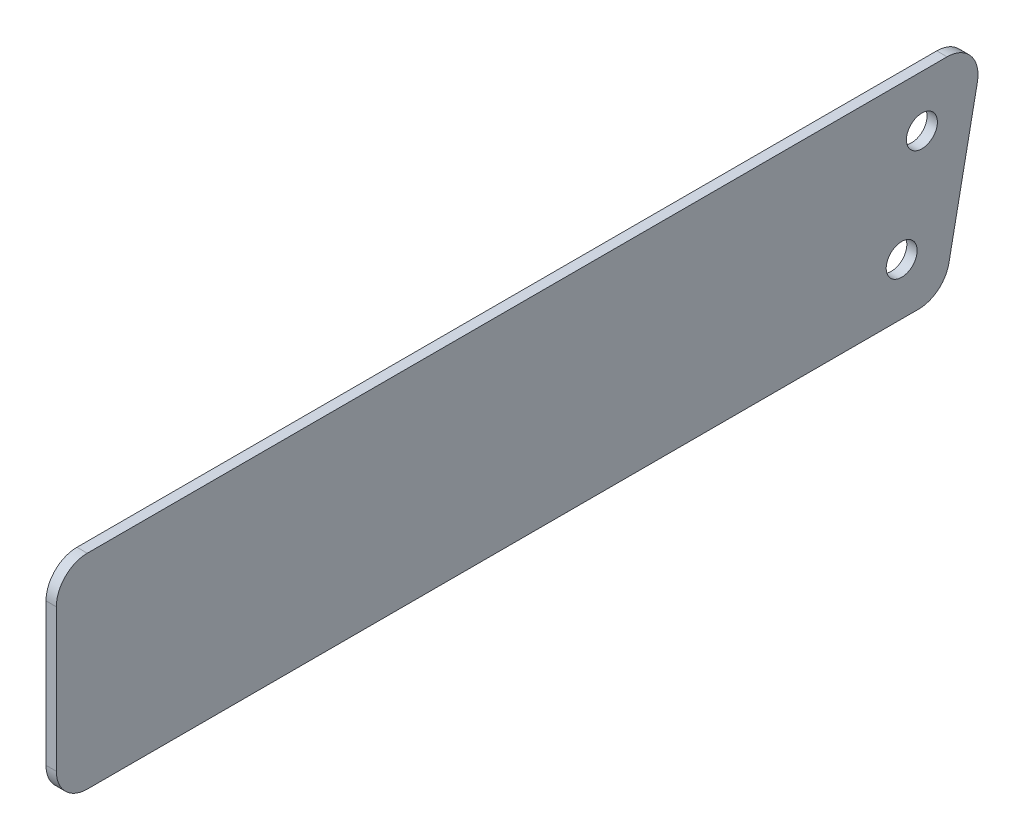
ISO-10303-21;
HEADER;
FILE_DESCRIPTION(('STEP AP214'),'2;1');
FILE_NAME('part.step','',(''),(''),'','','');
FILE_SCHEMA(('AUTOMOTIVE_DESIGN { 1 0 10303 214 1 1 1 1 }'));
ENDSEC;
DATA;
#1=APPLICATION_CONTEXT('core data for automotive mechanical design processes');
#2=APPLICATION_PROTOCOL_DEFINITION('international standard','automotive_design',2000,#1);
#3=PRODUCT_CONTEXT('',#1,'mechanical');
#4=PRODUCT('Part','Part','',(#3));
#5=PRODUCT_RELATED_PRODUCT_CATEGORY('part','',(#4));
#6=PRODUCT_DEFINITION_FORMATION('','',#4);
#7=PRODUCT_DEFINITION_CONTEXT('part definition',#1,'design');
#8=PRODUCT_DEFINITION('design','',#6,#7);
#9=PRODUCT_DEFINITION_SHAPE('','',#8);
#10=(LENGTH_UNIT() NAMED_UNIT(*) SI_UNIT(.MILLI.,.METRE.));
#11=(NAMED_UNIT(*) PLANE_ANGLE_UNIT() SI_UNIT($,.RADIAN.));
#12=(NAMED_UNIT(*) SI_UNIT($,.STERADIAN.) SOLID_ANGLE_UNIT());
#13=UNCERTAINTY_MEASURE_WITH_UNIT(LENGTH_MEASURE(1.E-05),#10,'distance_accuracy_value','');
#14=(GEOMETRIC_REPRESENTATION_CONTEXT(3) GLOBAL_UNCERTAINTY_ASSIGNED_CONTEXT((#13)) GLOBAL_UNIT_ASSIGNED_CONTEXT((#10,
#11,#12)) REPRESENTATION_CONTEXT('',''));
#15=CARTESIAN_POINT('',(0.,0.,0.));
#16=DIRECTION('',(0.,0.,1.));
#17=DIRECTION('',(1.,0.,0.));
#18=AXIS2_PLACEMENT_3D('',#15,#16,#17);
#19=CARTESIAN_POINT('',(1.,-8.27300976539509,-41.3647953242755));
#20=DIRECTION('',(0.,-0.196117290802072,-0.980580444557434));
#21=DIRECTION('',(0.,0.980580444557434,-0.196117290802072));
#22=AXIS2_PLACEMENT_3D('',#19,#20,#21);
#23=PLANE('',#22);
#24=DIRECTION('',(0.,-0.980580444557435,0.196117290802072));
#25=VECTOR('',#24,1.);
#26=CARTESIAN_POINT('',(1.,-8.27300976539509,-41.3647953242755));
#27=LINE('',#26,#25);
#28=CARTESIAN_POINT('',(1.,6.31455035038097,-44.282325227301));
#29=VERTEX_POINT('',#28);
#30=CARTESIAN_POINT('',(1.,-7.49125409519338,-41.5211474165083));
#31=VERTEX_POINT('',#30);
#32=EDGE_CURVE('E204',#29,#31,#27,.T.);
#33=ORIENTED_EDGE('',*,*,#32,.T.);
#34=DIRECTION('',(-1.,0.,0.));
#35=VECTOR('',#34,1.);
#36=CARTESIAN_POINT('',(0.,-7.49125409519338,-41.5211474165083));
#37=LINE('',#36,#35);
#38=CARTESIAN_POINT('',(0.,-7.49125409519338,-41.5211474165083));
#39=VERTEX_POINT('',#38);
#40=EDGE_CURVE('E127',#31,#39,#37,.T.);
#41=ORIENTED_EDGE('',*,*,#40,.T.);
#42=DIRECTION('',(0.,-0.980580444557435,0.196117290802072));
#43=VECTOR('',#42,1.);
#44=CARTESIAN_POINT('',(0.,-8.27300976539509,-41.3647953242755));
#45=LINE('',#44,#43);
#46=CARTESIAN_POINT('',(0.,6.31455035038097,-44.282325227301));
#47=VERTEX_POINT('',#46);
#48=EDGE_CURVE('E110',#47,#39,#45,.T.);
#49=ORIENTED_EDGE('',*,*,#48,.F.);
#50=DIRECTION('',(-1.,0.,0.));
#51=VECTOR('',#50,1.);
#52=CARTESIAN_POINT('',(1.,6.31455035038096,-44.282325227301));
#53=LINE('',#52,#51);
#54=EDGE_CURVE('E124',#47,#29,#53,.F.);
#55=ORIENTED_EDGE('',*,*,#54,.T.);
#56=EDGE_LOOP('',(#33,#41,#49,#55));
#57=FACE_BOUND('',#56,.T.);
#58=ADVANCED_FACE('F41',(#57),#23,.T.);
#59=CARTESIAN_POINT('',(1.,9.90290222278718,0.));
#60=DIRECTION('',(0.,1.,0.));
#61=DIRECTION('',(0.,0.,1.));
#62=AXIS2_PLACEMENT_3D('',#59,#60,#61);
#63=PLANE('',#62);
#64=DIRECTION('',(0.,0.,-1.));
#65=VECTOR('',#64,1.);
#66=CARTESIAN_POINT('',(1.,9.90290222278718,0.));
#67=LINE('',#66,#65);
#68=CARTESIAN_POINT('',(1.,9.90290222278718,42.));
#69=VERTEX_POINT('',#68);
#70=CARTESIAN_POINT('',(1.,9.90290222278718,-41.3405838936287));
#71=VERTEX_POINT('',#70);
#72=EDGE_CURVE('E200',#69,#71,#67,.T.);
#73=ORIENTED_EDGE('',*,*,#72,.T.);
#74=DIRECTION('',(-1.,0.,0.));
#75=VECTOR('',#74,1.);
#76=CARTESIAN_POINT('',(1.,9.90290222278718,-41.3405838936287));
#77=LINE('',#76,#75);
#78=CARTESIAN_POINT('',(0.,9.90290222278718,-41.3405838936287));
#79=VERTEX_POINT('',#78);
#80=EDGE_CURVE('E174',#71,#79,#77,.T.);
#81=ORIENTED_EDGE('',*,*,#80,.T.);
#82=DIRECTION('',(0.,0.,-1.));
#83=VECTOR('',#82,1.);
#84=CARTESIAN_POINT('',(0.,9.90290222278718,0.));
#85=LINE('',#84,#83);
#86=CARTESIAN_POINT('',(0.,9.90290222278718,42.));
#87=VERTEX_POINT('',#86);
#88=EDGE_CURVE('E112',#87,#79,#85,.T.);
#89=ORIENTED_EDGE('',*,*,#88,.F.);
#90=DIRECTION('',(-1.,0.,0.));
#91=VECTOR('',#90,1.);
#92=CARTESIAN_POINT('',(1.,9.90290222278718,42.));
#93=LINE('',#92,#91);
#94=EDGE_CURVE('E171',#87,#69,#93,.F.);
#95=ORIENTED_EDGE('',*,*,#94,.T.);
#96=EDGE_LOOP('',(#73,#81,#89,#95));
#97=FACE_BOUND('',#96,.T.);
#98=ADVANCED_FACE('F241',(#97),#63,.T.);
#99=CARTESIAN_POINT('',(1.,0.,45.));
#100=DIRECTION('',(0.,0.,1.));
#101=DIRECTION('',(1.,0.,0.));
#102=AXIS2_PLACEMENT_3D('',#99,#100,#101);
#103=PLANE('',#102);
#104=DIRECTION('',(0.,1.,0.));
#105=VECTOR('',#104,1.);
#106=CARTESIAN_POINT('',(0.,0.,45.));
#107=LINE('',#106,#105);
#108=CARTESIAN_POINT('',(0.,-6.90290222278717,45.));
#109=VERTEX_POINT('',#108);
#110=CARTESIAN_POINT('',(0.,6.90290222278718,45.));
#111=VERTEX_POINT('',#110);
#112=EDGE_CURVE('E181',#109,#111,#107,.T.);
#113=ORIENTED_EDGE('',*,*,#112,.F.);
#114=DIRECTION('',(-1.,0.,0.));
#115=VECTOR('',#114,1.);
#116=CARTESIAN_POINT('',(1.,-6.90290222278717,45.));
#117=LINE('',#116,#115);
#118=CARTESIAN_POINT('',(1.,-6.90290222278717,45.));
#119=VERTEX_POINT('',#118);
#120=EDGE_CURVE('E11',#109,#119,#117,.F.);
#121=ORIENTED_EDGE('',*,*,#120,.T.);
#122=DIRECTION('',(0.,1.,0.));
#123=VECTOR('',#122,1.);
#124=CARTESIAN_POINT('',(1.,0.,45.));
#125=LINE('',#124,#123);
#126=CARTESIAN_POINT('',(1.,6.90290222278718,45.));
#127=VERTEX_POINT('',#126);
#128=EDGE_CURVE('E142',#119,#127,#125,.T.);
#129=ORIENTED_EDGE('',*,*,#128,.T.);
#130=DIRECTION('',(-1.,0.,0.));
#131=VECTOR('',#130,1.);
#132=CARTESIAN_POINT('',(1.,6.90290222278718,45.));
#133=LINE('',#132,#131);
#134=EDGE_CURVE('E50',#127,#111,#133,.T.);
#135=ORIENTED_EDGE('',*,*,#134,.T.);
#136=EDGE_LOOP('',(#113,#121,#129,#135));
#137=FACE_BOUND('',#136,.T.);
#138=ADVANCED_FACE('F180',(#137),#103,.T.);
#139=CARTESIAN_POINT('',(1.,4.90290222278718,-38.9009731560478));
#140=DIRECTION('',(-1.,0.,0.));
#141=DIRECTION('',(0.,0.,1.));
#142=AXIS2_PLACEMENT_3D('',#139,#140,#141);
#143=CYLINDRICAL_SURFACE('',#142,1.5);
#144=CARTESIAN_POINT('',(1.,4.90290222278718,-38.9009731560478));
#145=DIRECTION('',(1.,0.,0.));
#146=DIRECTION('',(0.,0.,-1.));
#147=AXIS2_PLACEMENT_3D('',#144,#145,#146);
#148=CIRCLE('',#147,1.5);
#149=CARTESIAN_POINT('',(1.,4.90290222278718,-40.4009731560478));
#150=VERTEX_POINT('',#149);
#151=EDGE_CURVE('E207',#150,#150,#148,.T.);
#152=ORIENTED_EDGE('',*,*,#151,.T.);
#153=EDGE_LOOP('',(#152));
#154=FACE_BOUND('',#153,.T.);
#155=CARTESIAN_POINT('',(0.,4.90290222278718,-38.9009731560478));
#156=DIRECTION('',(1.,0.,0.));
#157=DIRECTION('',(0.,0.,-1.));
#158=AXIS2_PLACEMENT_3D('',#155,#156,#157);
#159=CIRCLE('',#158,1.5);
#160=CARTESIAN_POINT('',(0.,4.90290222278718,-40.4009731560478));
#161=VERTEX_POINT('',#160);
#162=EDGE_CURVE('E129',#161,#161,#159,.T.);
#163=ORIENTED_EDGE('',*,*,#162,.F.);
#164=EDGE_LOOP('',(#163));
#165=FACE_BOUND('',#164,.T.);
#166=ADVANCED_FACE('F250',(#154,#165),#143,.F.);
#167=CARTESIAN_POINT('',(1.,-4.90290222278717,-36.9398002480271));
#168=DIRECTION('',(-1.,0.,0.));
#169=DIRECTION('',(0.,0.,1.));
#170=AXIS2_PLACEMENT_3D('',#167,#168,#169);
#171=CYLINDRICAL_SURFACE('',#170,1.5);
#172=CARTESIAN_POINT('',(1.,-4.90290222278717,-36.9398002480271));
#173=DIRECTION('',(1.,0.,0.));
#174=DIRECTION('',(0.,0.,-1.));
#175=AXIS2_PLACEMENT_3D('',#172,#173,#174);
#176=CIRCLE('',#175,1.5);
#177=CARTESIAN_POINT('',(1.,-4.90290222278717,-38.4398002480271));
#178=VERTEX_POINT('',#177);
#179=EDGE_CURVE('E188',#178,#178,#176,.T.);
#180=ORIENTED_EDGE('',*,*,#179,.T.);
#181=EDGE_LOOP('',(#180));
#182=FACE_BOUND('',#181,.T.);
#183=CARTESIAN_POINT('',(0.,-4.90290222278717,-36.9398002480271));
#184=DIRECTION('',(1.,0.,0.));
#185=DIRECTION('',(0.,0.,-1.));
#186=AXIS2_PLACEMENT_3D('',#183,#184,#185);
#187=CIRCLE('',#186,1.5);
#188=CARTESIAN_POINT('',(0.,-4.90290222278717,-38.4398002480271));
#189=VERTEX_POINT('',#188);
#190=EDGE_CURVE('E194',#189,#189,#187,.T.);
#191=ORIENTED_EDGE('',*,*,#190,.F.);
#192=EDGE_LOOP('',(#191));
#193=FACE_BOUND('',#192,.T.);
#194=ADVANCED_FACE('F215',(#182,#193),#171,.F.);
#195=CARTESIAN_POINT('',(1.,-9.90290222278717,0.));
#196=DIRECTION('',(0.,1.,0.));
#197=DIRECTION('',(0.,0.,1.));
#198=AXIS2_PLACEMENT_3D('',#195,#196,#197);
#199=PLANE('',#198);
#200=DIRECTION('',(0.,0.,-1.));
#201=VECTOR('',#200,1.);
#202=CARTESIAN_POINT('',(0.,-9.90290222278717,0.));
#203=LINE('',#202,#201);
#204=CARTESIAN_POINT('',(0.,-9.90290222278717,42.));
#205=VERTEX_POINT('',#204);
#206=CARTESIAN_POINT('',(0.,-9.90290222278717,-38.579406082836));
#207=VERTEX_POINT('',#206);
#208=EDGE_CURVE('E145',#205,#207,#203,.T.);
#209=ORIENTED_EDGE('',*,*,#208,.T.);
#210=DIRECTION('',(-1.,0.,0.));
#211=VECTOR('',#210,1.);
#212=CARTESIAN_POINT('',(1.,-9.90290222278717,-38.579406082836));
#213=LINE('',#212,#211);
#214=CARTESIAN_POINT('',(1.,-9.90290222278717,-38.579406082836));
#215=VERTEX_POINT('',#214);
#216=EDGE_CURVE('E158',#207,#215,#213,.F.);
#217=ORIENTED_EDGE('',*,*,#216,.T.);
#218=DIRECTION('',(0.,0.,-1.));
#219=VECTOR('',#218,1.);
#220=CARTESIAN_POINT('',(1.,-9.90290222278717,0.));
#221=LINE('',#220,#219);
#222=CARTESIAN_POINT('',(1.,-9.90290222278717,42.));
#223=VERTEX_POINT('',#222);
#224=EDGE_CURVE('E135',#223,#215,#221,.T.);
#225=ORIENTED_EDGE('',*,*,#224,.F.);
#226=DIRECTION('',(-1.,0.,0.));
#227=VECTOR('',#226,1.);
#228=CARTESIAN_POINT('',(0.,-9.90290222278717,42.));
#229=LINE('',#228,#227);
#230=EDGE_CURVE('E154',#223,#205,#229,.T.);
#231=ORIENTED_EDGE('',*,*,#230,.T.);
#232=EDGE_LOOP('',(#209,#217,#225,#231));
#233=FACE_BOUND('',#232,.T.);
#234=ADVANCED_FACE('F221',(#233),#199,.F.);
#235=CARTESIAN_POINT('',(1.,0.,0.));
#236=DIRECTION('',(1.,0.,0.));
#237=DIRECTION('',(0.,0.,-1.));
#238=AXIS2_PLACEMENT_3D('',#235,#236,#237);
#239=PLANE('',#238);
#240=ORIENTED_EDGE('',*,*,#179,.F.);
#241=EDGE_LOOP('',(#240));
#242=FACE_BOUND('',#241,.T.);
#243=ORIENTED_EDGE('',*,*,#151,.F.);
#244=EDGE_LOOP('',(#243));
#245=FACE_BOUND('',#244,.T.);
#246=ORIENTED_EDGE('',*,*,#224,.T.);
#247=CARTESIAN_POINT('',(1.,-6.90290222278717,-38.579406082836));
#248=DIRECTION('',(1.,0.,0.));
#249=DIRECTION('',(0.,0.,-1.));
#250=AXIS2_PLACEMENT_3D('',#247,#248,#249);
#251=CIRCLE('',#250,3.);
#252=EDGE_CURVE('E168',#215,#31,#251,.T.);
#253=ORIENTED_EDGE('',*,*,#252,.T.);
#254=ORIENTED_EDGE('',*,*,#32,.F.);
#255=CARTESIAN_POINT('',(1.,6.90290222278718,-41.3405838936287));
#256=DIRECTION('',(1.,0.,0.));
#257=DIRECTION('',(0.,0.,-1.));
#258=AXIS2_PLACEMENT_3D('',#255,#256,#257);
#259=CIRCLE('',#258,3.);
#260=EDGE_CURVE('E133',#29,#71,#259,.T.);
#261=ORIENTED_EDGE('',*,*,#260,.T.);
#262=ORIENTED_EDGE('',*,*,#72,.F.);
#263=CARTESIAN_POINT('',(1.,6.90290222278718,42.));
#264=DIRECTION('',(1.,0.,0.));
#265=DIRECTION('',(0.,0.,-1.));
#266=AXIS2_PLACEMENT_3D('',#263,#264,#265);
#267=CIRCLE('',#266,3.);
#268=EDGE_CURVE('E57',#69,#127,#267,.T.);
#269=ORIENTED_EDGE('',*,*,#268,.T.);
#270=ORIENTED_EDGE('',*,*,#128,.F.);
#271=CARTESIAN_POINT('',(1.,-6.90290222278717,42.));
#272=DIRECTION('',(1.,0.,0.));
#273=DIRECTION('',(0.,0.,-1.));
#274=AXIS2_PLACEMENT_3D('',#271,#272,#273);
#275=CIRCLE('',#274,3.);
#276=EDGE_CURVE('E163',#119,#223,#275,.T.);
#277=ORIENTED_EDGE('',*,*,#276,.T.);
#278=EDGE_LOOP('',(#246,#253,#254,#261,#262,#269,#270,#277));
#279=FACE_BOUND('',#278,.T.);
#280=ADVANCED_FACE('F218',(#242,#245,#279),#239,.T.);
#281=CARTESIAN_POINT('',(0.,0.,0.));
#282=DIRECTION('',(1.,0.,0.));
#283=DIRECTION('',(0.,0.,-1.));
#284=AXIS2_PLACEMENT_3D('',#281,#282,#283);
#285=PLANE('',#284);
#286=ORIENTED_EDGE('',*,*,#190,.T.);
#287=EDGE_LOOP('',(#286));
#288=FACE_BOUND('',#287,.T.);
#289=ORIENTED_EDGE('',*,*,#162,.T.);
#290=EDGE_LOOP('',(#289));
#291=FACE_BOUND('',#290,.T.);
#292=ORIENTED_EDGE('',*,*,#48,.T.);
#293=CARTESIAN_POINT('',(0.,-6.90290222278717,-38.579406082836));
#294=DIRECTION('',(1.,0.,0.));
#295=DIRECTION('',(0.,0.,-1.));
#296=AXIS2_PLACEMENT_3D('',#293,#294,#295);
#297=CIRCLE('',#296,3.);
#298=EDGE_CURVE('E118',#39,#207,#297,.F.);
#299=ORIENTED_EDGE('',*,*,#298,.T.);
#300=ORIENTED_EDGE('',*,*,#208,.F.);
#301=CARTESIAN_POINT('',(0.,-6.90290222278717,42.));
#302=DIRECTION('',(1.,0.,0.));
#303=DIRECTION('',(0.,0.,-1.));
#304=AXIS2_PLACEMENT_3D('',#301,#302,#303);
#305=CIRCLE('',#304,3.);
#306=EDGE_CURVE('E119',#205,#109,#305,.F.);
#307=ORIENTED_EDGE('',*,*,#306,.T.);
#308=ORIENTED_EDGE('',*,*,#112,.T.);
#309=CARTESIAN_POINT('',(0.,6.90290222278718,42.));
#310=DIRECTION('',(1.,0.,0.));
#311=DIRECTION('',(0.,0.,-1.));
#312=AXIS2_PLACEMENT_3D('',#309,#310,#311);
#313=CIRCLE('',#312,3.);
#314=EDGE_CURVE('E139',#111,#87,#313,.F.);
#315=ORIENTED_EDGE('',*,*,#314,.T.);
#316=ORIENTED_EDGE('',*,*,#88,.T.);
#317=CARTESIAN_POINT('',(0.,6.90290222278718,-41.3405838936287));
#318=DIRECTION('',(1.,0.,0.));
#319=DIRECTION('',(0.,0.,-1.));
#320=AXIS2_PLACEMENT_3D('',#317,#318,#319);
#321=CIRCLE('',#320,3.);
#322=EDGE_CURVE('E107',#79,#47,#321,.F.);
#323=ORIENTED_EDGE('',*,*,#322,.T.);
#324=EDGE_LOOP('',(#292,#299,#300,#307,#308,#315,#316,#323));
#325=FACE_BOUND('',#324,.T.);
#326=ADVANCED_FACE('F109',(#288,#291,#325),#285,.F.);
#327=CARTESIAN_POINT('',(1.,-6.90290222278717,-38.579406082836));
#328=DIRECTION('',(1.,0.,0.));
#329=DIRECTION('',(0.,0.,-1.));
#330=AXIS2_PLACEMENT_3D('',#327,#328,#329);
#331=CYLINDRICAL_SURFACE('',#330,3.);
#332=ORIENTED_EDGE('',*,*,#252,.F.);
#333=ORIENTED_EDGE('',*,*,#216,.F.);
#334=ORIENTED_EDGE('',*,*,#298,.F.);
#335=ORIENTED_EDGE('',*,*,#40,.F.);
#336=EDGE_LOOP('',(#332,#333,#334,#335));
#337=FACE_BOUND('',#336,.T.);
#338=ADVANCED_FACE('F231',(#337),#331,.T.);
#339=CARTESIAN_POINT('',(1.,6.90290222278718,-41.3405838936287));
#340=DIRECTION('',(-1.,0.,0.));
#341=DIRECTION('',(0.,0.,1.));
#342=AXIS2_PLACEMENT_3D('',#339,#340,#341);
#343=CYLINDRICAL_SURFACE('',#342,3.);
#344=ORIENTED_EDGE('',*,*,#260,.F.);
#345=ORIENTED_EDGE('',*,*,#54,.F.);
#346=ORIENTED_EDGE('',*,*,#322,.F.);
#347=ORIENTED_EDGE('',*,*,#80,.F.);
#348=EDGE_LOOP('',(#344,#345,#346,#347));
#349=FACE_BOUND('',#348,.T.);
#350=ADVANCED_FACE('F132',(#349),#343,.T.);
#351=CARTESIAN_POINT('',(1.,-6.90290222278717,42.));
#352=DIRECTION('',(1.,0.,0.));
#353=DIRECTION('',(0.,0.,-1.));
#354=AXIS2_PLACEMENT_3D('',#351,#352,#353);
#355=CYLINDRICAL_SURFACE('',#354,3.);
#356=ORIENTED_EDGE('',*,*,#276,.F.);
#357=ORIENTED_EDGE('',*,*,#120,.F.);
#358=ORIENTED_EDGE('',*,*,#306,.F.);
#359=ORIENTED_EDGE('',*,*,#230,.F.);
#360=EDGE_LOOP('',(#356,#357,#358,#359));
#361=FACE_BOUND('',#360,.T.);
#362=ADVANCED_FACE('F233',(#361),#355,.T.);
#363=CARTESIAN_POINT('',(1.,6.90290222278718,42.));
#364=DIRECTION('',(-1.,0.,0.));
#365=DIRECTION('',(0.,0.,1.));
#366=AXIS2_PLACEMENT_3D('',#363,#364,#365);
#367=CYLINDRICAL_SURFACE('',#366,3.);
#368=ORIENTED_EDGE('',*,*,#268,.F.);
#369=ORIENTED_EDGE('',*,*,#94,.F.);
#370=ORIENTED_EDGE('',*,*,#314,.F.);
#371=ORIENTED_EDGE('',*,*,#134,.F.);
#372=EDGE_LOOP('',(#368,#369,#370,#371));
#373=FACE_BOUND('',#372,.T.);
#374=ADVANCED_FACE('F43',(#373),#367,.T.);
#375=CLOSED_SHELL('',(#58,#98,#138,#166,#194,#234,#280,#326,#338,#350,#362,#374));
#376=MANIFOLD_SOLID_BREP('B2',#375);
#377=ADVANCED_BREP_SHAPE_REPRESENTATION('',(#18,#376),#14);
#378=SHAPE_DEFINITION_REPRESENTATION(#9,#377);
ENDSEC;
END-ISO-10303-21;
